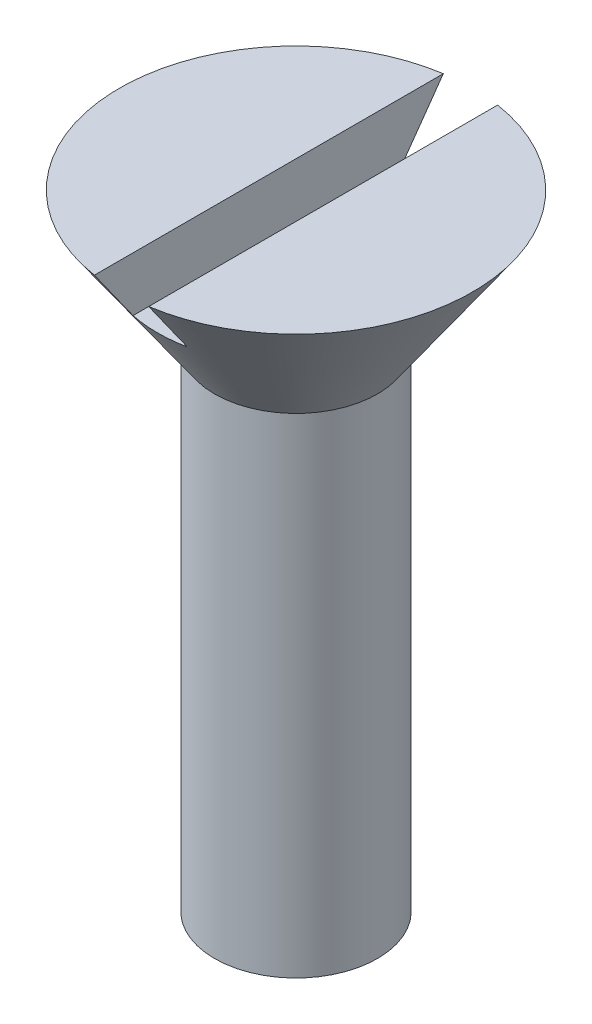
ISO-10303-21;
HEADER;
FILE_DESCRIPTION(('STEP AP214'),'2;1');
FILE_NAME('part.step','',(''),(''),'','','');
FILE_SCHEMA(('AUTOMOTIVE_DESIGN { 1 0 10303 214 1 1 1 1 }'));
ENDSEC;
DATA;
#1=APPLICATION_CONTEXT('core data for automotive mechanical design processes');
#2=APPLICATION_PROTOCOL_DEFINITION('international standard','automotive_design',2000,#1);
#3=PRODUCT_CONTEXT('',#1,'mechanical');
#4=PRODUCT('Part','Part','',(#3));
#5=PRODUCT_RELATED_PRODUCT_CATEGORY('part','',(#4));
#6=PRODUCT_DEFINITION_FORMATION('','',#4);
#7=PRODUCT_DEFINITION_CONTEXT('part definition',#1,'design');
#8=PRODUCT_DEFINITION('design','',#6,#7);
#9=PRODUCT_DEFINITION_SHAPE('','',#8);
#10=(LENGTH_UNIT() NAMED_UNIT(*) SI_UNIT(.MILLI.,.METRE.));
#11=(NAMED_UNIT(*) PLANE_ANGLE_UNIT() SI_UNIT($,.RADIAN.));
#12=(NAMED_UNIT(*) SI_UNIT($,.STERADIAN.) SOLID_ANGLE_UNIT());
#13=UNCERTAINTY_MEASURE_WITH_UNIT(LENGTH_MEASURE(1.E-05),#10,'distance_accuracy_value','');
#14=(GEOMETRIC_REPRESENTATION_CONTEXT(3) GLOBAL_UNCERTAINTY_ASSIGNED_CONTEXT((#13)) GLOBAL_UNIT_ASSIGNED_CONTEXT((#10,
#11,#12)) REPRESENTATION_CONTEXT('',''));
#15=CARTESIAN_POINT('',(0.,0.,0.));
#16=DIRECTION('',(0.,0.,1.));
#17=DIRECTION('',(1.,0.,0.));
#18=AXIS2_PLACEMENT_3D('',#15,#16,#17);
#19=CARTESIAN_POINT('',(0.,0.,0.));
#20=DIRECTION('',(0.,-1.,0.));
#21=DIRECTION('',(0.,0.,-1.));
#22=AXIS2_PLACEMENT_3D('',#19,#20,#21);
#23=PLANE('',#22);
#24=CARTESIAN_POINT('',(0.,0.,0.));
#25=DIRECTION('',(0.,1.,0.));
#26=DIRECTION('',(0.,0.,1.));
#27=AXIS2_PLACEMENT_3D('',#24,#25,#26);
#28=CIRCLE('',#27,6.5);
#29=CARTESIAN_POINT('',(0.999999999999999,0.,6.42261628933256));
#30=VERTEX_POINT('',#29);
#31=CARTESIAN_POINT('',(0.999999999999999,0.,-6.42261628933256));
#32=VERTEX_POINT('',#31);
#33=EDGE_CURVE('E112',#30,#32,#28,.T.);
#34=ORIENTED_EDGE('',*,*,#33,.T.);
#35=DIRECTION('',(0.,0.,1.));
#36=VECTOR('',#35,1.);
#37=CARTESIAN_POINT('',(0.999999999999999,0.,0.));
#38=LINE('',#37,#36);
#39=EDGE_CURVE('E124',#32,#30,#38,.T.);
#40=ORIENTED_EDGE('',*,*,#39,.T.);
#41=EDGE_LOOP('',(#34,#40));
#42=FACE_BOUND('',#41,.T.);
#43=ADVANCED_FACE('F38',(#42),#23,.F.);
#44=CARTESIAN_POINT('',(-1.,0.,-6.42261628933256));
#45=VERTEX_POINT('',#44);
#46=CARTESIAN_POINT('',(-1.,0.,6.42261628933256));
#47=VERTEX_POINT('',#46);
#48=EDGE_CURVE('E103',#45,#47,#28,.T.);
#49=ORIENTED_EDGE('',*,*,#48,.T.);
#50=DIRECTION('',(0.,0.,-1.));
#51=VECTOR('',#50,1.);
#52=CARTESIAN_POINT('',(-1.,0.,0.));
#53=LINE('',#52,#51);
#54=EDGE_CURVE('E59',#47,#45,#53,.T.);
#55=ORIENTED_EDGE('',*,*,#54,.T.);
#56=EDGE_LOOP('',(#49,#55));
#57=FACE_BOUND('',#56,.T.);
#58=ADVANCED_FACE('F40',(#57),#23,.F.);
#59=CARTESIAN_POINT('',(0.,-5.,0.));
#60=DIRECTION('',(0.,1.,0.));
#61=DIRECTION('',(0.,0.,1.));
#62=AXIS2_PLACEMENT_3D('',#59,#60,#61);
#63=CONICAL_SURFACE('',#62,2.99999999999999,0.610725964389209);
#64=CARTESIAN_POINT('',(0.,-2.,0.));
#65=DIRECTION('',(0.,-1.,0.));
#66=DIRECTION('',(1.,0.,0.));
#67=AXIS2_PLACEMENT_3D('',#64,#65,#66);
#68=CIRCLE('',#67,5.1);
#69=CARTESIAN_POINT('',(-1.,-2.,-5.00099990001999));
#70=VERTEX_POINT('',#69);
#71=CARTESIAN_POINT('',(1.,-2.,-5.00099990001999));
#72=VERTEX_POINT('',#71);
#73=EDGE_CURVE('E52',#70,#72,#68,.T.);
#74=ORIENTED_EDGE('',*,*,#73,.T.);
#75=CARTESIAN_POINT('',(0.999999999999999,0.0007,6.4231121927069));
#76=CARTESIAN_POINT('',(0.999999999999999,-0.250402973210666,6.24521507547193));
#77=CARTESIAN_POINT('',(1.,-0.501430348754828,6.06721105785793));
#78=CARTESIAN_POINT('',(1.,-1.00328543473532,5.71088793330971));
#79=CARTESIAN_POINT('',(1.,-1.25411313141089,5.53256880699692));
#80=CARTESIAN_POINT('',(1.,-1.75624717314772,5.17499647886701));
#81=CARTESIAN_POINT('',(1.,-2.00755266877064,4.99574208349888));
#82=CARTESIAN_POINT('',(1.,-2.50975864588097,4.63669913452874));
#83=CARTESIAN_POINT('',(1.,-2.76065915109722,4.45691061411515));
#84=CARTESIAN_POINT('',(1.,-3.32066567942011,4.05434246098986));
#85=CARTESIAN_POINT('',(1.,-3.62962925783441,3.8313642453559));
#86=CARTESIAN_POINT('',(1.,-4.09206747695827,3.49544297230532));
#87=CARTESIAN_POINT('',(1.,-4.24606151106159,3.38321524822285));
#88=CARTESIAN_POINT('',(1.,-4.55357761222401,3.15811915839282));
#89=CARTESIAN_POINT('',(1.,-4.70709968602469,3.04525080186235));
#90=CARTESIAN_POINT('',(1.,-5.01310136529784,2.81893473483322));
#91=CARTESIAN_POINT('',(1.,-5.16558264221547,2.70548928810726));
#92=CARTESIAN_POINT('',(1.,-5.4696305535057,2.47735955209801));
#93=CARTESIAN_POINT('',(1.,-5.62119713375148,2.36267519060134));
#94=CARTESIAN_POINT('',(1.,-5.92289177437991,2.1315340082038));
#95=CARTESIAN_POINT('',(1.,-6.07302034770651,2.01507786083153));
#96=CARTESIAN_POINT('',(1.,-6.29649432515915,1.83823431248961));
#97=CARTESIAN_POINT('',(1.,-6.37069560583633,1.77892951008024));
#98=CARTESIAN_POINT('',(1.,-6.5183323674737,1.65937552484642));
#99=CARTESIAN_POINT('',(1.,-6.59176787191011,1.59912637111531));
#100=CARTESIAN_POINT('',(1.,-6.7136597336248,1.49735496061012));
#101=CARTESIAN_POINT('',(1.,-6.76240331660417,1.45617701216027));
#102=CARTESIAN_POINT('',(1.,-6.85929593016328,1.37311830533831));
#103=CARTESIAN_POINT('',(1.,-6.90744491465202,1.33123749306917));
#104=CARTESIAN_POINT('',(1.,-7.00314777347608,1.24644783826052));
#105=CARTESIAN_POINT('',(1.,-7.05069880836866,1.20353578171963));
#106=CARTESIAN_POINT('',(1.,-7.14476589149894,1.11660199553977));
#107=CARTESIAN_POINT('',(1.,-7.1912821074775,1.07258044824988));
#108=CARTESIAN_POINT('',(1.,-7.28171784528768,0.984258875571617));
#109=CARTESIAN_POINT('',(1.,-7.32567344502511,0.939995978319389));
#110=CARTESIAN_POINT('',(1.,-7.41170748248032,0.849685965186152));
#111=CARTESIAN_POINT('',(1.,-7.45378642200473,0.803639332492838));
#112=CARTESIAN_POINT('',(1.,-7.53499857979569,0.709408627074622));
#113=CARTESIAN_POINT('',(1.,-7.57414577631689,0.661236704334909));
#114=CARTESIAN_POINT('',(1.,-7.64825600880547,0.561804744039553));
#115=CARTESIAN_POINT('',(1.,-7.68322653705194,0.510550491890746));
#116=CARTESIAN_POINT('',(1.,-7.72761842246044,0.435811432213107));
#117=CARTESIAN_POINT('',(1.,-7.73983903465965,0.41399467218249));
#118=CARTESIAN_POINT('',(1.,-7.76294754857881,0.369660988832991));
#119=CARTESIAN_POINT('',(1.,-7.77383497797313,0.347143820893273));
#120=CARTESIAN_POINT('',(1.,-7.80400329022562,0.278664441259211));
#121=CARTESIAN_POINT('',(1.,-7.82090864278289,0.23158364958173));
#122=CARTESIAN_POINT('',(1.,-7.84352580818614,0.143751659910721));
#123=CARTESIAN_POINT('',(1.,-7.85070500394179,0.103387133416539));
#124=CARTESIAN_POINT('',(1.,-7.85797486648314,0.0219594036923791));
#125=CARTESIAN_POINT('',(1.,-7.85806047775885,-0.0191042769698473));
#126=CARTESIAN_POINT('',(1.,-7.85112051399619,-0.100503321516527));
#127=CARTESIAN_POINT('',(1.,-7.84411070636893,-0.140840098426756));
#128=CARTESIAN_POINT('',(1.,-7.82406213975651,-0.219934025983467));
#129=CARTESIAN_POINT('',(1.,-7.81102230238591,-0.258690892735783));
#130=CARTESIAN_POINT('',(1.,-7.7818803300287,-0.330465253321093));
#131=CARTESIAN_POINT('',(1.,-7.76621918682465,-0.363667547268327));
#132=CARTESIAN_POINT('',(1.,-7.73206005853268,-0.428595619012462));
#133=CARTESIAN_POINT('',(1.,-7.71355951008275,-0.46032002852788));
#134=CARTESIAN_POINT('',(1.,-7.6743322865622,-0.5225859506623));
#135=CARTESIAN_POINT('',(1.,-7.65359402327538,-0.553120070167379));
#136=CARTESIAN_POINT('',(1.,-7.61050564213081,-0.612996566707766));
#137=CARTESIAN_POINT('',(1.,-7.58815626111845,-0.642339479063729));
#138=CARTESIAN_POINT('',(1.,-7.51783485578597,-0.730686952033613));
#139=CARTESIAN_POINT('',(1.,-7.46786171803236,-0.788092695306658));
#140=CARTESIAN_POINT('',(1.,-7.3647360693223,-0.899994752825927));
#141=CARTESIAN_POINT('',(1.,-7.31158074042104,-0.954488405025341));
#142=CARTESIAN_POINT('',(1.,-7.20306181203027,-1.0614930611547));
#143=CARTESIAN_POINT('',(1.,-7.1476930802223,-1.11399883295362));
#144=CARTESIAN_POINT('',(1.,-7.03551697028451,-1.21745270602299));
#145=CARTESIAN_POINT('',(1.,-6.97870941712551,-1.26840061610318));
#146=CARTESIAN_POINT('',(1.,-6.86363116069684,-1.36949512242319));
#147=CARTESIAN_POINT('',(1.,-6.80535267353106,-1.41963282838066));
#148=CARTESIAN_POINT('',(1.,-6.68801152965094,-1.51898955075177));
#149=CARTESIAN_POINT('',(1.,-6.62894880619906,-1.56820848811072));
#150=CARTESIAN_POINT('',(1.,-6.51033141743055,-1.66583472159219));
#151=CARTESIAN_POINT('',(1.,-6.4507777988516,-1.71424329188765));
#152=CARTESIAN_POINT('',(1.,-6.33120593130725,-1.81047784179129));
#153=CARTESIAN_POINT('',(1.,-6.27118769885118,-1.8583038419462));
#154=CARTESIAN_POINT('',(1.,-6.08157815972814,-2.00819700899561));
#155=CARTESIAN_POINT('',(1.,-5.95131874461278,-2.10941865781128));
#156=CARTESIAN_POINT('',(1.,-5.68969473050537,-2.31042525016914));
#157=CARTESIAN_POINT('',(1.,-5.55833009681153,-2.41021014833135));
#158=CARTESIAN_POINT('',(1.,-5.29482181660963,-2.60877175431697));
#159=CARTESIAN_POINT('',(1.,-5.16267809559559,-2.70754836316465));
#160=CARTESIAN_POINT('',(1.,-4.89783636936224,-2.90435620432975));
#161=CARTESIAN_POINT('',(1.,-4.76513836088272,-3.00238743225341));
#162=CARTESIAN_POINT('',(1.,-4.36613967246591,-3.29586613365337));
#163=CARTESIAN_POINT('',(1.,-4.09922627089914,-3.49048011542742));
#164=CARTESIAN_POINT('',(1.,-3.56444630719682,-3.87835826017653));
#165=CARTESIAN_POINT('',(1.,-3.29657980020392,-4.07162249938514));
#166=CARTESIAN_POINT('',(1.,-2.77654815539,-4.44551854449073));
#167=CARTESIAN_POINT('',(1.,-2.52442061432674,-4.62620266343095));
#168=CARTESIAN_POINT('',(1.,-2.01976705897738,-4.98702305613862));
#169=CARTESIAN_POINT('',(1.,-1.76724103743861,-5.16715931975581));
#170=CARTESIAN_POINT('',(1.,-1.26226503192869,-5.52677185493383));
#171=CARTESIAN_POINT('',(1.,-1.00981545797446,-5.70624870244839));
#172=CARTESIAN_POINT('',(1.,-0.504702660936665,-6.06489037383144));
#173=CARTESIAN_POINT('',(0.999999999999999,-0.252039442419039,-6.24405520412977));
#174=CARTESIAN_POINT('',(0.999999999999999,0.000699999999999627,-6.4231121927069));
#175=B_SPLINE_CURVE_WITH_KNOTS('',3,(#75,#76,#77,#78,#79,#80,#81,#82,#83,#84,#85,#86,#87,#88,
#89,#90,#91,#92,#93,#94,#95,#96,#97,#98,#99,#100,#101,#102,#103,#104,#105,#106,#107,#108,#109,
#110,#111,#112,#113,#114,#115,#116,#117,#118,#119,#120,#121,#122,#123,#124,#125,#126,#127,#128,
#129,#130,#131,#132,#133,#134,#135,#136,#137,#138,#139,#140,#141,#142,#143,#144,#145,#146,#147,
#148,#149,#150,#151,#152,#153,#154,#155,#156,#157,#158,#159,#160,#161,#162,#163,#164,#165,#166,
#167,#168,#169,#170,#171,#172,#173,#174),.UNSPECIFIED.,.F.,.F.,(4,2,2,2,2,2,2,2,2,2,2,2,2,2,2,2,
2,2,2,2,2,2,2,2,2,2,2,2,2,2,2,2,2,2,2,2,2,2,2,2,2,2,2,2,2,2,2,2,2,4),(0.,0.923201509240994,
1.84646192008956,2.77251707641884,3.69851584706988,4.84157654201851,5.41322473304254,
5.98486472022838,6.55502115896762,7.12521101202564,7.6951892752624,7.98015070767564,
8.26510337825438,8.45652467666822,8.6479607213415,8.84010072326166,9.0322093495508,
9.21931349760209,9.40636731153533,9.59246346676996,9.77822061490546,9.85319794763914,
9.92820176727315,10.0775406581727,10.1999903842997,10.3225273780829,10.4447926671675,
10.5670798301291,10.6770443346272,10.7871087034044,10.8977732132442,11.0083874278571,
11.2364917496226,11.4648011428321,11.6936747166946,11.9225762674854,12.1531967152284,
12.3838369158942,12.6140718598639,12.844298660001,13.3391746463812,13.8340662293547,
14.3290059335492,14.8239485529879,15.8149277270123,16.8058504703305,17.7364058749223,
18.6669784163907,19.5962168450814,20.5254358925289),.UNSPECIFIED.);
#176=EDGE_CURVE('E12',#72,#32,#175,.T.);
#177=ORIENTED_EDGE('',*,*,#176,.T.);
#178=ORIENTED_EDGE('',*,*,#33,.F.);
#179=CARTESIAN_POINT('',(1.,-2.,5.00099990001999));
#180=VERTEX_POINT('',#179);
#181=EDGE_CURVE('E42',#30,#180,#175,.T.);
#182=ORIENTED_EDGE('',*,*,#181,.T.);
#183=CARTESIAN_POINT('',(-1.,-2.,5.00099990001999));
#184=VERTEX_POINT('',#183);
#185=EDGE_CURVE('E95',#180,#184,#68,.T.);
#186=ORIENTED_EDGE('',*,*,#185,.T.);
#187=CARTESIAN_POINT('',(-1.,0.0007,-6.4231121927069));
#188=CARTESIAN_POINT('',(-1.,-0.250402973210667,-6.24521507547193));
#189=CARTESIAN_POINT('',(-1.,-0.50143034875483,-6.06721105785793));
#190=CARTESIAN_POINT('',(-1.,-1.00328543473533,-5.71088793330971));
#191=CARTESIAN_POINT('',(-1.,-1.25411313141089,-5.53256880699692));
#192=CARTESIAN_POINT('',(-1.,-1.75624717314772,-5.17499647886701));
#193=CARTESIAN_POINT('',(-1.,-2.00755266877064,-4.99574208349887));
#194=CARTESIAN_POINT('',(-1.,-2.50975864588098,-4.63669913452874));
#195=CARTESIAN_POINT('',(-1.,-2.76065915109723,-4.45691061411514));
#196=CARTESIAN_POINT('',(-1.,-3.32066567942011,-4.05434246098985));
#197=CARTESIAN_POINT('',(-1.,-3.62962925783442,-3.8313642453559));
#198=CARTESIAN_POINT('',(-1.,-4.09206747695828,-3.49544297230531));
#199=CARTESIAN_POINT('',(-1.,-4.2460615110616,-3.38321524822285));
#200=CARTESIAN_POINT('',(-1.,-4.55357761222402,-3.15811915839282));
#201=CARTESIAN_POINT('',(-1.,-4.70709968602469,-3.04525080186235));
#202=CARTESIAN_POINT('',(-1.,-5.01310136529785,-2.81893473483322));
#203=CARTESIAN_POINT('',(-1.,-5.16558264221547,-2.70548928810726));
#204=CARTESIAN_POINT('',(-1.,-5.4696305535057,-2.47735955209801));
#205=CARTESIAN_POINT('',(-1.,-5.62119713375148,-2.36267519060134));
#206=CARTESIAN_POINT('',(-1.,-5.92289177437991,-2.1315340082038));
#207=CARTESIAN_POINT('',(-1.,-6.07302034770651,-2.01507786083153));
#208=CARTESIAN_POINT('',(-1.,-6.29649432515915,-1.83823431248961));
#209=CARTESIAN_POINT('',(-1.,-6.37069560583634,-1.77892951008024));
#210=CARTESIAN_POINT('',(-1.,-6.5183323674737,-1.65937552484642));
#211=CARTESIAN_POINT('',(-1.,-6.59176787191011,-1.59912637111531));
#212=CARTESIAN_POINT('',(-1.,-6.7136597336248,-1.49735496061012));
#213=CARTESIAN_POINT('',(-1.,-6.76240331660418,-1.45617701216027));
#214=CARTESIAN_POINT('',(-1.,-6.85929593016328,-1.37311830533831));
#215=CARTESIAN_POINT('',(-1.,-6.90744491465202,-1.33123749306917));
#216=CARTESIAN_POINT('',(-1.,-7.00314777347608,-1.24644783826052));
#217=CARTESIAN_POINT('',(-0.999999999999999,-7.05069880836867,-1.20353578171963));
#218=CARTESIAN_POINT('',(-0.999999999999999,-7.14476589149894,-1.11660199553977));
#219=CARTESIAN_POINT('',(-0.999999999999999,-7.19128210747751,-1.07258044824988));
#220=CARTESIAN_POINT('',(-0.999999999999999,-7.28171784528768,-0.984258875571616));
#221=CARTESIAN_POINT('',(-0.999999999999999,-7.32567344502512,-0.939995978319388));
#222=CARTESIAN_POINT('',(-0.999999999999999,-7.41170748248032,-0.84968596518615));
#223=CARTESIAN_POINT('',(-0.999999999999999,-7.45378642200474,-0.803639332492837));
#224=CARTESIAN_POINT('',(-0.999999999999999,-7.53499857979569,-0.709408627074623));
#225=CARTESIAN_POINT('',(-0.999999999999999,-7.57414577631689,-0.66123670433491));
#226=CARTESIAN_POINT('',(-0.999999999999999,-7.64825600880547,-0.561804744039555));
#227=CARTESIAN_POINT('',(-0.999999999999999,-7.68322653705195,-0.510550491890748));
#228=CARTESIAN_POINT('',(-0.999999999999999,-7.72761842246044,-0.435811432213109));
#229=CARTESIAN_POINT('',(-0.999999999999999,-7.73983903465965,-0.413994672182492));
#230=CARTESIAN_POINT('',(-0.999999999999999,-7.76294754857882,-0.369660988832994));
#231=CARTESIAN_POINT('',(-0.999999999999999,-7.77383497797313,-0.347143820893276));
#232=CARTESIAN_POINT('',(-0.999999999999999,-7.80400329022562,-0.278664441259214));
#233=CARTESIAN_POINT('',(-0.999999999999999,-7.82090864278289,-0.231583649581732));
#234=CARTESIAN_POINT('',(-0.999999999999999,-7.84352580818614,-0.143751659910724));
#235=CARTESIAN_POINT('',(-0.999999999999999,-7.8507050039418,-0.103387133416541));
#236=CARTESIAN_POINT('',(-0.999999999999999,-7.85797486648314,-0.0219594036923807));
#237=CARTESIAN_POINT('',(-0.999999999999999,-7.85806047775885,0.0191042769698451));
#238=CARTESIAN_POINT('',(-0.999999999999999,-7.85112051399619,0.100503321516525));
#239=CARTESIAN_POINT('',(-0.999999999999999,-7.84411070636893,0.140840098426753));
#240=CARTESIAN_POINT('',(-0.999999999999999,-7.82406213975652,0.219934025983465));
#241=CARTESIAN_POINT('',(-0.999999999999999,-7.81102230238591,0.25869089273578));
#242=CARTESIAN_POINT('',(-0.999999999999999,-7.78188033002871,0.330465253321088));
#243=CARTESIAN_POINT('',(-0.999999999999999,-7.76621918682466,0.363667547268322));
#244=CARTESIAN_POINT('',(-0.999999999999999,-7.73206005853269,0.428595619012457));
#245=CARTESIAN_POINT('',(-0.999999999999999,-7.71355951008276,0.460320028527873));
#246=CARTESIAN_POINT('',(-0.999999999999999,-7.6743322865622,0.522585950662292));
#247=CARTESIAN_POINT('',(-0.999999999999999,-7.65359402327539,0.553120070167372));
#248=CARTESIAN_POINT('',(-0.999999999999999,-7.61050564213082,0.612996566707758));
#249=CARTESIAN_POINT('',(-0.999999999999999,-7.58815626111846,0.642339479063721));
#250=CARTESIAN_POINT('',(-0.999999999999999,-7.51783485578598,0.730686952033605));
#251=CARTESIAN_POINT('',(-0.999999999999999,-7.46786171803237,0.78809269530665));
#252=CARTESIAN_POINT('',(-0.999999999999999,-7.36473606932231,0.899994752825917));
#253=CARTESIAN_POINT('',(-0.999999999999999,-7.31158074042105,0.954488405025329));
#254=CARTESIAN_POINT('',(-0.999999999999999,-7.20306181203028,1.06149306115469));
#255=CARTESIAN_POINT('',(-0.999999999999999,-7.14769308022232,1.1139988329536));
#256=CARTESIAN_POINT('',(-0.999999999999999,-7.03551697028454,1.21745270602297));
#257=CARTESIAN_POINT('',(-1.,-6.97870941712554,1.26840061610317));
#258=CARTESIAN_POINT('',(-1.,-6.86363116069686,1.36949512242317));
#259=CARTESIAN_POINT('',(-1.,-6.80535267353108,1.41963282838064));
#260=CARTESIAN_POINT('',(-1.,-6.68801152965096,1.51898955075175));
#261=CARTESIAN_POINT('',(-1.,-6.62894880619908,1.5682084881107));
#262=CARTESIAN_POINT('',(-1.,-6.51033141743058,1.66583472159217));
#263=CARTESIAN_POINT('',(-1.,-6.45077779885163,1.71424329188762));
#264=CARTESIAN_POINT('',(-1.,-6.33120593130728,1.81047784179126));
#265=CARTESIAN_POINT('',(-1.,-6.27118769885122,1.85830384194618));
#266=CARTESIAN_POINT('',(-1.,-6.08157815972818,2.00819700899559));
#267=CARTESIAN_POINT('',(-1.,-5.95131874461282,2.10941865781125));
#268=CARTESIAN_POINT('',(-1.,-5.6896947305054,2.31042525016911));
#269=CARTESIAN_POINT('',(-1.,-5.55833009681157,2.41021014833133));
#270=CARTESIAN_POINT('',(-1.,-5.29482181660966,2.60877175431695));
#271=CARTESIAN_POINT('',(-1.,-5.16267809559562,2.70754836316463));
#272=CARTESIAN_POINT('',(-1.,-4.89783636936227,2.90435620432973));
#273=CARTESIAN_POINT('',(-1.,-4.76513836088275,3.00238743225339));
#274=CARTESIAN_POINT('',(-1.,-4.36613967246593,3.29586613365336));
#275=CARTESIAN_POINT('',(-1.,-4.09922627089916,3.4904801154274));
#276=CARTESIAN_POINT('',(-1.,-3.56444630719683,3.87835826017652));
#277=CARTESIAN_POINT('',(-1.,-3.29657980020394,4.07162249938513));
#278=CARTESIAN_POINT('',(-1.,-2.77654815539001,4.44551854449072));
#279=CARTESIAN_POINT('',(-1.,-2.52442061432675,4.62620266343094));
#280=CARTESIAN_POINT('',(-1.,-2.01976705897739,4.98702305613861));
#281=CARTESIAN_POINT('',(-1.,-1.76724103743862,5.16715931975581));
#282=CARTESIAN_POINT('',(-1.,-1.2622650319287,5.52677185493383));
#283=CARTESIAN_POINT('',(-1.,-1.00981545797446,5.70624870244838));
#284=CARTESIAN_POINT('',(-1.,-0.504702660936669,6.06489037383144));
#285=CARTESIAN_POINT('',(-1.,-0.252039442419041,6.24405520412977));
#286=CARTESIAN_POINT('',(-1.,0.000699999999999492,6.4231121927069));
#287=B_SPLINE_CURVE_WITH_KNOTS('',3,(#187,#188,#189,#190,#191,#192,#193,#194,#195,#196,#197,
#198,#199,#200,#201,#202,#203,#204,#205,#206,#207,#208,#209,#210,#211,#212,#213,#214,#215,#216,
#217,#218,#219,#220,#221,#222,#223,#224,#225,#226,#227,#228,#229,#230,#231,#232,#233,#234,#235,
#236,#237,#238,#239,#240,#241,#242,#243,#244,#245,#246,#247,#248,#249,#250,#251,#252,#253,#254,
#255,#256,#257,#258,#259,#260,#261,#262,#263,#264,#265,#266,#267,#268,#269,#270,#271,#272,#273,
#274,#275,#276,#277,#278,#279,#280,#281,#282,#283,#284,#285,#286),.UNSPECIFIED.,.F.,.F.,(4,2,2,
2,2,2,2,2,2,2,2,2,2,2,2,2,2,2,2,2,2,2,2,2,2,2,2,2,2,2,2,2,2,2,2,2,2,2,2,2,2,2,2,2,2,2,2,2,2,4),
(0.,0.923201509240996,1.84646192008956,2.77251707641884,3.6985158470699,4.84157654201852,
5.41322473304255,5.98486472022839,6.55502115896762,7.12521101202564,7.6951892752624,
7.98015070767564,8.26510337825439,8.45652467666823,8.6479607213415,8.84010072326166,
9.03220934955081,9.21931349760209,9.40636731153533,9.59246346676997,9.77822061490546,
9.85319794763915,9.92820176727315,10.0775406581727,10.1999903842997,10.3225273780829,
10.4447926671675,10.5670798301291,10.6770443346272,10.7871087034044,10.8977732132442,
11.0083874278571,11.2364917496226,11.4648011428321,11.6936747166946,11.9225762674854,
12.1531967152284,12.3838369158942,12.6140718598639,12.844298660001,13.3391746463811,
13.8340662293547,14.3290059335492,14.8239485529879,15.8149277270123,16.8058504703305,
17.7364058749223,18.6669784163906,19.5962168450814,20.5254358925289),.UNSPECIFIED.);
#288=EDGE_CURVE('E97',#184,#47,#287,.T.);
#289=ORIENTED_EDGE('',*,*,#288,.T.);
#290=ORIENTED_EDGE('',*,*,#48,.F.);
#291=EDGE_CURVE('E94',#45,#70,#287,.T.);
#292=ORIENTED_EDGE('',*,*,#291,.T.);
#293=EDGE_LOOP('',(#74,#177,#178,#182,#186,#289,#290,#292));
#294=FACE_BOUND('',#293,.T.);
#295=CARTESIAN_POINT('',(0.,-5.,0.));
#296=DIRECTION('',(0.,1.,0.));
#297=DIRECTION('',(0.,0.,1.));
#298=AXIS2_PLACEMENT_3D('',#295,#296,#297);
#299=CIRCLE('',#298,2.99999999999999);
#300=CARTESIAN_POINT('',(0.,-5.,2.99999999999999));
#301=VERTEX_POINT('',#300);
#302=EDGE_CURVE('E117',#301,#301,#299,.T.);
#303=ORIENTED_EDGE('',*,*,#302,.T.);
#304=EDGE_LOOP('',(#303));
#305=FACE_BOUND('',#304,.T.);
#306=ADVANCED_FACE('F100',(#294,#305),#63,.T.);
#307=CARTESIAN_POINT('',(0.,0.,0.));
#308=DIRECTION('',(0.,1.,0.));
#309=DIRECTION('',(0.,0.,1.));
#310=AXIS2_PLACEMENT_3D('',#307,#308,#309);
#311=CYLINDRICAL_SURFACE('',#310,2.99999999999999);
#312=ORIENTED_EDGE('',*,*,#302,.F.);
#313=EDGE_LOOP('',(#312));
#314=FACE_BOUND('',#313,.T.);
#315=CARTESIAN_POINT('',(0.,-23.,0.));
#316=DIRECTION('',(0.,1.,0.));
#317=DIRECTION('',(0.,0.,1.));
#318=AXIS2_PLACEMENT_3D('',#315,#316,#317);
#319=CIRCLE('',#318,2.99999999999999);
#320=CARTESIAN_POINT('',(0.,-23.,2.99999999999999));
#321=VERTEX_POINT('',#320);
#322=EDGE_CURVE('E121',#321,#321,#319,.T.);
#323=ORIENTED_EDGE('',*,*,#322,.T.);
#324=EDGE_LOOP('',(#323));
#325=FACE_BOUND('',#324,.T.);
#326=ADVANCED_FACE('F137',(#314,#325),#311,.T.);
#327=CARTESIAN_POINT('',(0.,-24.7320508075689,0.));
#328=DIRECTION('',(0.,1.,0.));
#329=DIRECTION('',(0.,0.,1.));
#330=AXIS2_PLACEMENT_3D('',#327,#328,#329);
#331=CONICAL_SURFACE('',#330,0.,1.04719755119659);
#332=ORIENTED_EDGE('',*,*,#322,.F.);
#333=EDGE_LOOP('',(#332));
#334=FACE_BOUND('',#333,.T.);
#335=CARTESIAN_POINT('',(0.,-24.7320508075689,0.));
#336=VERTEX_POINT('',#335);
#337=VERTEX_LOOP('',#336);
#338=FACE_BOUND('',#337,.T.);
#339=ADVANCED_FACE('F141',(#334,#338),#331,.T.);
#340=CARTESIAN_POINT('',(0.999999999999999,2.,-15.));
#341=DIRECTION('',(1.,0.,0.));
#342=DIRECTION('',(0.,1.,0.));
#343=AXIS2_PLACEMENT_3D('',#340,#341,#342);
#344=PLANE('',#343);
#345=ORIENTED_EDGE('',*,*,#39,.F.);
#346=ORIENTED_EDGE('',*,*,#176,.F.);
#347=DIRECTION('',(0.,0.,1.));
#348=VECTOR('',#347,1.);
#349=CARTESIAN_POINT('',(1.,-2.,-15.));
#350=LINE('',#349,#348);
#351=EDGE_CURVE('E91',#72,#180,#350,.T.);
#352=ORIENTED_EDGE('',*,*,#351,.T.);
#353=ORIENTED_EDGE('',*,*,#181,.F.);
#354=EDGE_LOOP('',(#345,#346,#352,#353));
#355=FACE_BOUND('',#354,.T.);
#356=ADVANCED_FACE('F128',(#355),#344,.F.);
#357=CARTESIAN_POINT('',(-1.,-2.,-15.));
#358=DIRECTION('',(0.,-1.,0.));
#359=DIRECTION('',(1.,0.,0.));
#360=AXIS2_PLACEMENT_3D('',#357,#358,#359);
#361=PLANE('',#360);
#362=ORIENTED_EDGE('',*,*,#351,.F.);
#363=ORIENTED_EDGE('',*,*,#73,.F.);
#364=DIRECTION('',(0.,0.,1.));
#365=VECTOR('',#364,1.);
#366=CARTESIAN_POINT('',(-1.,-2.,-15.));
#367=LINE('',#366,#365);
#368=EDGE_CURVE('E88',#70,#184,#367,.T.);
#369=ORIENTED_EDGE('',*,*,#368,.T.);
#370=ORIENTED_EDGE('',*,*,#185,.F.);
#371=EDGE_LOOP('',(#362,#363,#369,#370));
#372=FACE_BOUND('',#371,.T.);
#373=ADVANCED_FACE('F87',(#372),#361,.F.);
#374=CARTESIAN_POINT('',(-1.,2.,-15.));
#375=DIRECTION('',(-1.,0.,0.));
#376=DIRECTION('',(0.,-1.,0.));
#377=AXIS2_PLACEMENT_3D('',#374,#375,#376);
#378=PLANE('',#377);
#379=ORIENTED_EDGE('',*,*,#54,.F.);
#380=ORIENTED_EDGE('',*,*,#288,.F.);
#381=ORIENTED_EDGE('',*,*,#368,.F.);
#382=ORIENTED_EDGE('',*,*,#291,.F.);
#383=EDGE_LOOP('',(#379,#380,#381,#382));
#384=FACE_BOUND('',#383,.T.);
#385=ADVANCED_FACE('F96',(#384),#378,.F.);
#386=CLOSED_SHELL('',(#43,#58,#306,#326,#339,#356,#373,#385));
#387=MANIFOLD_SOLID_BREP('B2',#386);
#388=ADVANCED_BREP_SHAPE_REPRESENTATION('',(#18,#387),#14);
#389=SHAPE_DEFINITION_REPRESENTATION(#9,#388);
ENDSEC;
END-ISO-10303-21;
